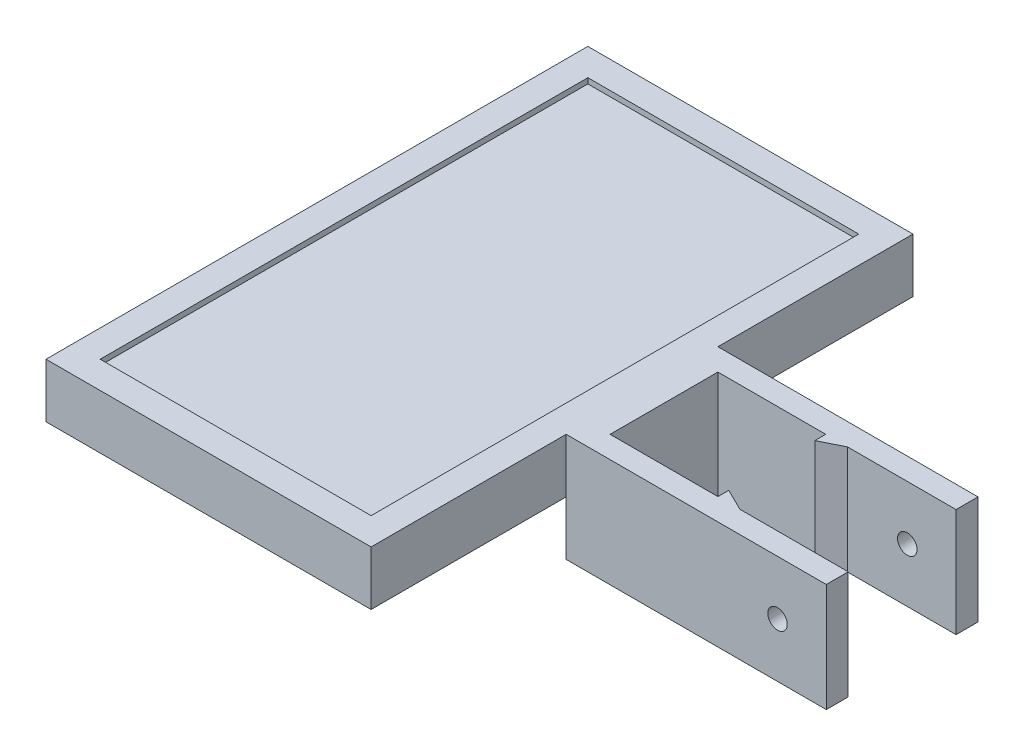
ISO-10303-21;
HEADER;
FILE_DESCRIPTION(('STEP AP214'),'2;1');
FILE_NAME('part.step','',(''),(''),'','','');
FILE_SCHEMA(('AUTOMOTIVE_DESIGN { 1 0 10303 214 1 1 1 1 }'));
ENDSEC;
DATA;
#1=APPLICATION_CONTEXT('core data for automotive mechanical design processes');
#2=APPLICATION_PROTOCOL_DEFINITION('international standard','automotive_design',2000,#1);
#3=PRODUCT_CONTEXT('',#1,'mechanical');
#4=PRODUCT('Part','Part','',(#3));
#5=PRODUCT_RELATED_PRODUCT_CATEGORY('part','',(#4));
#6=PRODUCT_DEFINITION_FORMATION('','',#4);
#7=PRODUCT_DEFINITION_CONTEXT('part definition',#1,'design');
#8=PRODUCT_DEFINITION('design','',#6,#7);
#9=PRODUCT_DEFINITION_SHAPE('','',#8);
#10=(LENGTH_UNIT() NAMED_UNIT(*) SI_UNIT(.MILLI.,.METRE.));
#11=(NAMED_UNIT(*) PLANE_ANGLE_UNIT() SI_UNIT($,.RADIAN.));
#12=(NAMED_UNIT(*) SI_UNIT($,.STERADIAN.) SOLID_ANGLE_UNIT());
#13=UNCERTAINTY_MEASURE_WITH_UNIT(LENGTH_MEASURE(1.E-05),#10,'distance_accuracy_value','');
#14=(GEOMETRIC_REPRESENTATION_CONTEXT(3) GLOBAL_UNCERTAINTY_ASSIGNED_CONTEXT((#13)) GLOBAL_UNIT_ASSIGNED_CONTEXT((#10,
#11,#12)) REPRESENTATION_CONTEXT('',''));
#15=CARTESIAN_POINT('',(0.,0.,0.));
#16=DIRECTION('',(0.,0.,1.));
#17=DIRECTION('',(1.,0.,0.));
#18=AXIS2_PLACEMENT_3D('',#15,#16,#17);
#19=CARTESIAN_POINT('',(-74.,10.,-50.));
#20=DIRECTION('',(-1.,0.,0.));
#21=DIRECTION('',(0.,0.,1.));
#22=AXIS2_PLACEMENT_3D('',#19,#20,#21);
#23=PLANE('',#22);
#24=DIRECTION('',(0.,0.,1.));
#25=VECTOR('',#24,1.);
#26=CARTESIAN_POINT('',(-74.,10.,-50.));
#27=LINE('',#26,#25);
#28=CARTESIAN_POINT('',(-74.,10.,-50.));
#29=VERTEX_POINT('',#28);
#30=CARTESIAN_POINT('',(-74.,10.,-5.));
#31=VERTEX_POINT('',#30);
#32=EDGE_CURVE('E314',#29,#31,#27,.T.);
#33=ORIENTED_EDGE('',*,*,#32,.T.);
#34=DIRECTION('',(0.,0.,1.));
#35=VECTOR('',#34,1.);
#36=CARTESIAN_POINT('',(-74.,10.,-50.001));
#37=LINE('',#36,#35);
#38=CARTESIAN_POINT('',(-74.,10.,5.));
#39=VERTEX_POINT('',#38);
#40=EDGE_CURVE('E282',#31,#39,#37,.T.);
#41=ORIENTED_EDGE('',*,*,#40,.T.);
#42=CARTESIAN_POINT('',(-74.,10.,50.));
#43=VERTEX_POINT('',#42);
#44=EDGE_CURVE('E311',#39,#43,#27,.T.);
#45=ORIENTED_EDGE('',*,*,#44,.T.);
#46=DIRECTION('',(0.,1.,0.));
#47=VECTOR('',#46,1.);
#48=CARTESIAN_POINT('',(-74.,10.,50.));
#49=LINE('',#48,#47);
#50=CARTESIAN_POINT('',(-74.,20.,50.));
#51=VERTEX_POINT('',#50);
#52=EDGE_CURVE('E341',#43,#51,#49,.T.);
#53=ORIENTED_EDGE('',*,*,#52,.T.);
#54=DIRECTION('',(0.,0.,1.));
#55=VECTOR('',#54,1.);
#56=CARTESIAN_POINT('',(-74.,20.,-50.));
#57=LINE('',#56,#55);
#58=CARTESIAN_POINT('',(-74.,20.,-50.));
#59=VERTEX_POINT('',#58);
#60=EDGE_CURVE('E332',#59,#51,#57,.T.);
#61=ORIENTED_EDGE('',*,*,#60,.F.);
#62=DIRECTION('',(0.,1.,0.));
#63=VECTOR('',#62,1.);
#64=CARTESIAN_POINT('',(-74.,10.,-50.));
#65=LINE('',#64,#63);
#66=EDGE_CURVE('E347',#29,#59,#65,.T.);
#67=ORIENTED_EDGE('',*,*,#66,.F.);
#68=EDGE_LOOP('',(#33,#41,#45,#53,#61,#67));
#69=FACE_BOUND('',#68,.T.);
#70=ADVANCED_FACE('F47',(#69),#23,.T.);
#71=CARTESIAN_POINT('',(-88.142135623731,10.,-5.));
#72=DIRECTION('',(0.,0.,1.));
#73=DIRECTION('',(0.,-1.,0.));
#74=AXIS2_PLACEMENT_3D('',#71,#72,#73);
#75=PLANE('',#74);
#76=DIRECTION('',(0.986393923832144,-0.164398987305357,0.));
#77=VECTOR('',#76,1.);
#78=CARTESIAN_POINT('',(-14.,0.,-5.));
#79=LINE('',#78,#77);
#80=CARTESIAN_POINT('',(-14.,0.,-5.));
#81=VERTEX_POINT('',#80);
#82=EDGE_CURVE('E274',#31,#81,#79,.T.);
#83=ORIENTED_EDGE('',*,*,#82,.F.);
#84=DIRECTION('',(1.,0.,0.));
#85=VECTOR('',#84,1.);
#86=CARTESIAN_POINT('',(-88.142135623731,10.,-5.));
#87=LINE('',#86,#85);
#88=CARTESIAN_POINT('',(-14.,10.,-5.));
#89=VERTEX_POINT('',#88);
#90=EDGE_CURVE('E289',#31,#89,#87,.T.);
#91=ORIENTED_EDGE('',*,*,#90,.T.);
#92=DIRECTION('',(0.,-1.,0.));
#93=VECTOR('',#92,1.);
#94=CARTESIAN_POINT('',(-14.,10.,-5.));
#95=LINE('',#94,#93);
#96=EDGE_CURVE('E296',#89,#81,#95,.T.);
#97=ORIENTED_EDGE('',*,*,#96,.T.);
#98=EDGE_LOOP('',(#83,#91,#97));
#99=FACE_BOUND('',#98,.T.);
#100=ADVANCED_FACE('F661',(#99),#75,.F.);
#101=CARTESIAN_POINT('',(-88.142135623731,10.,5.));
#102=DIRECTION('',(0.,0.,-1.));
#103=DIRECTION('',(0.,1.,0.));
#104=AXIS2_PLACEMENT_3D('',#101,#102,#103);
#105=PLANE('',#104);
#106=DIRECTION('',(-0.986393923832144,0.164398987305357,0.));
#107=VECTOR('',#106,1.);
#108=CARTESIAN_POINT('',(-14.,0.,5.));
#109=LINE('',#108,#107);
#110=CARTESIAN_POINT('',(-14.,0.,5.));
#111=VERTEX_POINT('',#110);
#112=EDGE_CURVE('E281',#111,#39,#109,.T.);
#113=ORIENTED_EDGE('',*,*,#112,.F.);
#114=DIRECTION('',(0.,1.,0.));
#115=VECTOR('',#114,1.);
#116=CARTESIAN_POINT('',(-14.,10.,5.));
#117=LINE('',#116,#115);
#118=CARTESIAN_POINT('',(-14.,10.,5.));
#119=VERTEX_POINT('',#118);
#120=EDGE_CURVE('E291',#111,#119,#117,.T.);
#121=ORIENTED_EDGE('',*,*,#120,.T.);
#122=DIRECTION('',(1.,0.,0.));
#123=VECTOR('',#122,1.);
#124=CARTESIAN_POINT('',(-88.142135623731,10.,5.));
#125=LINE('',#124,#123);
#126=EDGE_CURVE('E76',#39,#119,#125,.T.);
#127=ORIENTED_EDGE('',*,*,#126,.F.);
#128=EDGE_LOOP('',(#113,#121,#127));
#129=FACE_BOUND('',#128,.T.);
#130=ADVANCED_FACE('F536',(#129),#105,.F.);
#131=CARTESIAN_POINT('',(-14.,20.,14.));
#132=DIRECTION('',(1.,0.,0.));
#133=DIRECTION('',(0.,0.,-1.));
#134=AXIS2_PLACEMENT_3D('',#131,#132,#133);
#135=PLANE('',#134);
#136=ORIENTED_EDGE('',*,*,#96,.F.);
#137=DIRECTION('',(0.,0.,-1.));
#138=VECTOR('',#137,1.);
#139=CARTESIAN_POINT('',(-14.,10.,-50.));
#140=LINE('',#139,#138);
#141=CARTESIAN_POINT('',(-14.,10.,-14.));
#142=VERTEX_POINT('',#141);
#143=EDGE_CURVE('E56',#89,#142,#140,.T.);
#144=ORIENTED_EDGE('',*,*,#143,.T.);
#145=DIRECTION('',(0.,-1.,0.));
#146=VECTOR('',#145,1.);
#147=CARTESIAN_POINT('',(-14.,20.,-14.));
#148=LINE('',#147,#146);
#149=CARTESIAN_POINT('',(-14.,0.,-14.));
#150=VERTEX_POINT('',#149);
#151=EDGE_CURVE('E508',#142,#150,#148,.T.);
#152=ORIENTED_EDGE('',*,*,#151,.T.);
#153=DIRECTION('',(0.,0.,1.));
#154=VECTOR('',#153,1.);
#155=CARTESIAN_POINT('',(-14.,0.,14.));
#156=LINE('',#155,#154);
#157=EDGE_CURVE('E500',#150,#81,#156,.T.);
#158=ORIENTED_EDGE('',*,*,#157,.T.);
#159=EDGE_LOOP('',(#136,#144,#152,#158));
#160=FACE_BOUND('',#159,.T.);
#161=ADVANCED_FACE('F518',(#160),#135,.F.);
#162=ORIENTED_EDGE('',*,*,#120,.F.);
#163=CARTESIAN_POINT('',(-14.,0.,14.));
#164=VERTEX_POINT('',#163);
#165=EDGE_CURVE('E497',#111,#164,#156,.T.);
#166=ORIENTED_EDGE('',*,*,#165,.T.);
#167=DIRECTION('',(0.,-1.,0.));
#168=VECTOR('',#167,1.);
#169=CARTESIAN_POINT('',(-14.,20.,14.));
#170=LINE('',#169,#168);
#171=CARTESIAN_POINT('',(-14.,10.,14.));
#172=VERTEX_POINT('',#171);
#173=EDGE_CURVE('E495',#172,#164,#170,.T.);
#174=ORIENTED_EDGE('',*,*,#173,.F.);
#175=EDGE_CURVE('E11',#172,#119,#140,.T.);
#176=ORIENTED_EDGE('',*,*,#175,.T.);
#177=EDGE_LOOP('',(#162,#166,#174,#176));
#178=FACE_BOUND('',#177,.T.);
#179=ADVANCED_FACE('F538',(#178),#135,.F.);
#180=CARTESIAN_POINT('',(0.,10.,0.));
#181=DIRECTION('',(0.,-1.,0.));
#182=DIRECTION('',(0.,0.,-1.));
#183=AXIS2_PLACEMENT_3D('',#180,#181,#182);
#184=PLANE('',#183);
#185=ORIENTED_EDGE('',*,*,#44,.F.);
#186=ORIENTED_EDGE('',*,*,#126,.T.);
#187=ORIENTED_EDGE('',*,*,#175,.F.);
#188=CARTESIAN_POINT('',(-14.,10.,50.));
#189=VERTEX_POINT('',#188);
#190=EDGE_CURVE('E64',#189,#172,#140,.T.);
#191=ORIENTED_EDGE('',*,*,#190,.F.);
#192=DIRECTION('',(1.,0.,0.));
#193=VECTOR('',#192,1.);
#194=CARTESIAN_POINT('',(-14.,10.,50.));
#195=LINE('',#194,#193);
#196=EDGE_CURVE('E318',#43,#189,#195,.T.);
#197=ORIENTED_EDGE('',*,*,#196,.F.);
#198=EDGE_LOOP('',(#185,#186,#187,#191,#197));
#199=FACE_BOUND('',#198,.T.);
#200=ADVANCED_FACE('F545',(#199),#184,.T.);
#201=CARTESIAN_POINT('',(0.,20.,0.));
#202=DIRECTION('',(0.,-1.,0.));
#203=DIRECTION('',(0.,0.,-1.));
#204=AXIS2_PLACEMENT_3D('',#201,#202,#203);
#205=PLANE('',#204);
#206=DIRECTION('',(1.,0.,0.));
#207=VECTOR('',#206,1.);
#208=CARTESIAN_POINT('',(-69.,20.,45.));
#209=LINE('',#208,#207);
#210=CARTESIAN_POINT('',(-69.,20.,45.));
#211=VERTEX_POINT('',#210);
#212=CARTESIAN_POINT('',(-19.,20.,45.));
#213=VERTEX_POINT('',#212);
#214=EDGE_CURVE('E266',#211,#213,#209,.T.);
#215=ORIENTED_EDGE('',*,*,#214,.F.);
#216=DIRECTION('',(0.,0.,1.));
#217=VECTOR('',#216,1.);
#218=CARTESIAN_POINT('',(-69.,20.,-45.));
#219=LINE('',#218,#217);
#220=CARTESIAN_POINT('',(-69.,20.,-45.));
#221=VERTEX_POINT('',#220);
#222=EDGE_CURVE('E69',#221,#211,#219,.T.);
#223=ORIENTED_EDGE('',*,*,#222,.F.);
#224=DIRECTION('',(-1.,0.,0.));
#225=VECTOR('',#224,1.);
#226=CARTESIAN_POINT('',(-69.,20.,-45.));
#227=LINE('',#226,#225);
#228=CARTESIAN_POINT('',(-19.,20.,-45.));
#229=VERTEX_POINT('',#228);
#230=EDGE_CURVE('E247',#229,#221,#227,.T.);
#231=ORIENTED_EDGE('',*,*,#230,.F.);
#232=DIRECTION('',(0.,0.,-1.));
#233=VECTOR('',#232,1.);
#234=CARTESIAN_POINT('',(-19.,20.,-45.));
#235=LINE('',#234,#233);
#236=EDGE_CURVE('E260',#213,#229,#235,.T.);
#237=ORIENTED_EDGE('',*,*,#236,.F.);
#238=EDGE_LOOP('',(#215,#223,#231,#237));
#239=FACE_BOUND('',#238,.T.);
#240=DIRECTION('',(-0.896630132720614,0.,0.442780312454624));
#241=VECTOR('',#240,1.);
#242=CARTESIAN_POINT('',(14.,20.,-9.95));
#243=LINE('',#242,#241);
#244=CARTESIAN_POINT('',(14.,20.,-9.95));
#245=VERTEX_POINT('',#244);
#246=CARTESIAN_POINT('',(9.95,20.,-7.94999999999999));
#247=VERTEX_POINT('',#246);
#248=EDGE_CURVE('E384',#245,#247,#243,.T.);
#249=ORIENTED_EDGE('',*,*,#248,.F.);
#250=DIRECTION('',(1.,0.,0.));
#251=VECTOR('',#250,1.);
#252=CARTESIAN_POINT('',(14.,20.,-9.95));
#253=LINE('',#252,#251);
#254=CARTESIAN_POINT('',(34.,20.,-9.95));
#255=VERTEX_POINT('',#254);
#256=EDGE_CURVE('E373',#245,#255,#253,.T.);
#257=ORIENTED_EDGE('',*,*,#256,.T.);
#258=DIRECTION('',(0.,0.,-1.));
#259=VECTOR('',#258,1.);
#260=CARTESIAN_POINT('',(34.,20.,-9.95));
#261=LINE('',#260,#259);
#262=CARTESIAN_POINT('',(34.,20.,-14.));
#263=VERTEX_POINT('',#262);
#264=EDGE_CURVE('E366',#255,#263,#261,.T.);
#265=ORIENTED_EDGE('',*,*,#264,.T.);
#266=DIRECTION('',(-1.,0.,0.));
#267=VECTOR('',#266,1.);
#268=CARTESIAN_POINT('',(-14.,20.,-14.));
#269=LINE('',#268,#267);
#270=CARTESIAN_POINT('',(-14.,20.,-14.));
#271=VERTEX_POINT('',#270);
#272=EDGE_CURVE('E482',#263,#271,#269,.T.);
#273=ORIENTED_EDGE('',*,*,#272,.T.);
#274=DIRECTION('',(0.,0.,-1.));
#275=VECTOR('',#274,1.);
#276=CARTESIAN_POINT('',(-14.,20.,-50.));
#277=LINE('',#276,#275);
#278=CARTESIAN_POINT('',(-14.,20.,-50.));
#279=VERTEX_POINT('',#278);
#280=EDGE_CURVE('E301',#271,#279,#277,.T.);
#281=ORIENTED_EDGE('',*,*,#280,.T.);
#282=DIRECTION('',(-1.,0.,0.));
#283=VECTOR('',#282,1.);
#284=CARTESIAN_POINT('',(-14.,20.,-50.));
#285=LINE('',#284,#283);
#286=EDGE_CURVE('E330',#279,#59,#285,.T.);
#287=ORIENTED_EDGE('',*,*,#286,.T.);
#288=ORIENTED_EDGE('',*,*,#60,.T.);
#289=DIRECTION('',(1.,0.,0.));
#290=VECTOR('',#289,1.);
#291=CARTESIAN_POINT('',(-14.,20.,50.));
#292=LINE('',#291,#290);
#293=CARTESIAN_POINT('',(-14.,20.,50.));
#294=VERTEX_POINT('',#293);
#295=EDGE_CURVE('E333',#51,#294,#292,.T.);
#296=ORIENTED_EDGE('',*,*,#295,.T.);
#297=CARTESIAN_POINT('',(-14.,20.,14.));
#298=VERTEX_POINT('',#297);
#299=EDGE_CURVE('E323',#294,#298,#277,.T.);
#300=ORIENTED_EDGE('',*,*,#299,.T.);
#301=DIRECTION('',(1.,0.,0.));
#302=VECTOR('',#301,1.);
#303=CARTESIAN_POINT('',(-14.,20.,14.));
#304=LINE('',#303,#302);
#305=CARTESIAN_POINT('',(34.,20.,14.));
#306=VERTEX_POINT('',#305);
#307=EDGE_CURVE('E488',#298,#306,#304,.T.);
#308=ORIENTED_EDGE('',*,*,#307,.T.);
#309=DIRECTION('',(0.,0.,-1.));
#310=VECTOR('',#309,1.);
#311=CARTESIAN_POINT('',(34.,20.,9.95));
#312=LINE('',#311,#310);
#313=CARTESIAN_POINT('',(34.,20.,9.95));
#314=VERTEX_POINT('',#313);
#315=EDGE_CURVE('E380',#306,#314,#312,.T.);
#316=ORIENTED_EDGE('',*,*,#315,.T.);
#317=DIRECTION('',(-1.,0.,0.));
#318=VECTOR('',#317,1.);
#319=CARTESIAN_POINT('',(14.,20.,9.95));
#320=LINE('',#319,#318);
#321=CARTESIAN_POINT('',(14.,20.,9.95));
#322=VERTEX_POINT('',#321);
#323=EDGE_CURVE('E392',#314,#322,#320,.T.);
#324=ORIENTED_EDGE('',*,*,#323,.T.);
#325=DIRECTION('',(0.896630132720614,0.,0.442780312454624));
#326=VECTOR('',#325,1.);
#327=CARTESIAN_POINT('',(9.95,20.,7.95));
#328=LINE('',#327,#326);
#329=CARTESIAN_POINT('',(9.95,20.,7.95));
#330=VERTEX_POINT('',#329);
#331=EDGE_CURVE('E414',#330,#322,#328,.T.);
#332=ORIENTED_EDGE('',*,*,#331,.F.);
#333=DIRECTION('',(0.,0.,-1.));
#334=VECTOR('',#333,1.);
#335=CARTESIAN_POINT('',(9.95,20.,9.95));
#336=LINE('',#335,#334);
#337=CARTESIAN_POINT('',(9.95,20.,9.95));
#338=VERTEX_POINT('',#337);
#339=EDGE_CURVE('E437',#338,#330,#336,.T.);
#340=ORIENTED_EDGE('',*,*,#339,.F.);
#341=DIRECTION('',(1.,0.,0.));
#342=VECTOR('',#341,1.);
#343=CARTESIAN_POINT('',(-9.95,20.,9.95));
#344=LINE('',#343,#342);
#345=CARTESIAN_POINT('',(-9.95,20.,9.95));
#346=VERTEX_POINT('',#345);
#347=EDGE_CURVE('E447',#346,#338,#344,.T.);
#348=ORIENTED_EDGE('',*,*,#347,.F.);
#349=DIRECTION('',(0.,0.,1.));
#350=VECTOR('',#349,1.);
#351=CARTESIAN_POINT('',(-9.95,20.,9.95));
#352=LINE('',#351,#350);
#353=CARTESIAN_POINT('',(-9.95,20.,-9.95));
#354=VERTEX_POINT('',#353);
#355=EDGE_CURVE('E449',#354,#346,#352,.T.);
#356=ORIENTED_EDGE('',*,*,#355,.F.);
#357=DIRECTION('',(-1.,0.,0.));
#358=VECTOR('',#357,1.);
#359=CARTESIAN_POINT('',(-9.95,20.,-9.95));
#360=LINE('',#359,#358);
#361=CARTESIAN_POINT('',(9.95,20.,-9.95));
#362=VERTEX_POINT('',#361);
#363=EDGE_CURVE('E445',#362,#354,#360,.T.);
#364=ORIENTED_EDGE('',*,*,#363,.F.);
#365=EDGE_CURVE('E444',#247,#362,#336,.T.);
#366=ORIENTED_EDGE('',*,*,#365,.F.);
#367=EDGE_LOOP('',(#249,#257,#265,#273,#281,#287,#288,#296,#300,#308,#316,#324,#332,#340,#348,
#356,#364,#366));
#368=FACE_BOUND('',#367,.T.);
#369=ADVANCED_FACE('F720',(#239,#368),#205,.F.);
#370=CARTESIAN_POINT('',(0.,0.,0.));
#371=DIRECTION('',(0.,-1.,0.));
#372=DIRECTION('',(0.,0.,-1.));
#373=AXIS2_PLACEMENT_3D('',#370,#371,#372);
#374=PLANE('',#373);
#375=DIRECTION('',(0.,0.,1.));
#376=VECTOR('',#375,1.);
#377=CARTESIAN_POINT('',(-14.,0.,-50.001));
#378=LINE('',#377,#376);
#379=EDGE_CURVE('E288',#81,#111,#378,.T.);
#380=ORIENTED_EDGE('',*,*,#379,.F.);
#381=ORIENTED_EDGE('',*,*,#157,.F.);
#382=DIRECTION('',(-1.,0.,0.));
#383=VECTOR('',#382,1.);
#384=CARTESIAN_POINT('',(-14.,0.,-14.));
#385=LINE('',#384,#383);
#386=CARTESIAN_POINT('',(34.,0.,-14.));
#387=VERTEX_POINT('',#386);
#388=EDGE_CURVE('E483',#387,#150,#385,.T.);
#389=ORIENTED_EDGE('',*,*,#388,.F.);
#390=DIRECTION('',(0.,0.,-1.));
#391=VECTOR('',#390,1.);
#392=CARTESIAN_POINT('',(34.,0.,-9.95));
#393=LINE('',#392,#391);
#394=CARTESIAN_POINT('',(34.,0.,-9.95));
#395=VERTEX_POINT('',#394);
#396=EDGE_CURVE('E370',#395,#387,#393,.T.);
#397=ORIENTED_EDGE('',*,*,#396,.F.);
#398=DIRECTION('',(1.,0.,0.));
#399=VECTOR('',#398,1.);
#400=CARTESIAN_POINT('',(14.,0.,-9.95));
#401=LINE('',#400,#399);
#402=CARTESIAN_POINT('',(14.,0.,-9.95));
#403=VERTEX_POINT('',#402);
#404=EDGE_CURVE('E361',#403,#395,#401,.T.);
#405=ORIENTED_EDGE('',*,*,#404,.F.);
#406=DIRECTION('',(-0.896630132720614,0.,0.442780312454624));
#407=VECTOR('',#406,1.);
#408=CARTESIAN_POINT('',(14.,0.,-9.95));
#409=LINE('',#408,#407);
#410=CARTESIAN_POINT('',(9.95,0.,-7.95));
#411=VERTEX_POINT('',#410);
#412=EDGE_CURVE('E408',#403,#411,#409,.T.);
#413=ORIENTED_EDGE('',*,*,#412,.T.);
#414=DIRECTION('',(0.,0.,-1.));
#415=VECTOR('',#414,1.);
#416=CARTESIAN_POINT('',(9.95,0.,9.95));
#417=LINE('',#416,#415);
#418=CARTESIAN_POINT('',(9.95,0.,-9.95));
#419=VERTEX_POINT('',#418);
#420=EDGE_CURVE('E430',#411,#419,#417,.T.);
#421=ORIENTED_EDGE('',*,*,#420,.T.);
#422=DIRECTION('',(-1.,0.,0.));
#423=VECTOR('',#422,1.);
#424=CARTESIAN_POINT('',(-9.95,0.,-9.95));
#425=LINE('',#424,#423);
#426=CARTESIAN_POINT('',(-9.95,0.,-9.95));
#427=VERTEX_POINT('',#426);
#428=EDGE_CURVE('E456',#419,#427,#425,.T.);
#429=ORIENTED_EDGE('',*,*,#428,.T.);
#430=DIRECTION('',(0.,0.,1.));
#431=VECTOR('',#430,1.);
#432=CARTESIAN_POINT('',(-9.95,0.,9.95));
#433=LINE('',#432,#431);
#434=CARTESIAN_POINT('',(-9.95,0.,9.95));
#435=VERTEX_POINT('',#434);
#436=EDGE_CURVE('E461',#427,#435,#433,.T.);
#437=ORIENTED_EDGE('',*,*,#436,.T.);
#438=DIRECTION('',(1.,0.,0.));
#439=VECTOR('',#438,1.);
#440=CARTESIAN_POINT('',(-9.95,0.,9.95));
#441=LINE('',#440,#439);
#442=CARTESIAN_POINT('',(9.95,0.,9.95));
#443=VERTEX_POINT('',#442);
#444=EDGE_CURVE('E468',#435,#443,#441,.T.);
#445=ORIENTED_EDGE('',*,*,#444,.T.);
#446=CARTESIAN_POINT('',(9.95,0.,7.95));
#447=VERTEX_POINT('',#446);
#448=EDGE_CURVE('E454',#443,#447,#417,.T.);
#449=ORIENTED_EDGE('',*,*,#448,.T.);
#450=DIRECTION('',(0.896630132720614,0.,0.442780312454624));
#451=VECTOR('',#450,1.);
#452=CARTESIAN_POINT('',(9.95,0.,7.95));
#453=LINE('',#452,#451);
#454=CARTESIAN_POINT('',(14.,0.,9.95));
#455=VERTEX_POINT('',#454);
#456=EDGE_CURVE('E411',#447,#455,#453,.T.);
#457=ORIENTED_EDGE('',*,*,#456,.T.);
#458=DIRECTION('',(-1.,0.,0.));
#459=VECTOR('',#458,1.);
#460=CARTESIAN_POINT('',(14.,0.,9.95));
#461=LINE('',#460,#459);
#462=CARTESIAN_POINT('',(34.,0.,9.95));
#463=VERTEX_POINT('',#462);
#464=EDGE_CURVE('E391',#463,#455,#461,.T.);
#465=ORIENTED_EDGE('',*,*,#464,.F.);
#466=DIRECTION('',(0.,0.,-1.));
#467=VECTOR('',#466,1.);
#468=CARTESIAN_POINT('',(34.,0.,9.95));
#469=LINE('',#468,#467);
#470=CARTESIAN_POINT('',(34.,0.,14.));
#471=VERTEX_POINT('',#470);
#472=EDGE_CURVE('E399',#471,#463,#469,.T.);
#473=ORIENTED_EDGE('',*,*,#472,.F.);
#474=DIRECTION('',(1.,0.,0.));
#475=VECTOR('',#474,1.);
#476=CARTESIAN_POINT('',(-14.,0.,14.));
#477=LINE('',#476,#475);
#478=EDGE_CURVE('E487',#164,#471,#477,.T.);
#479=ORIENTED_EDGE('',*,*,#478,.F.);
#480=ORIENTED_EDGE('',*,*,#165,.F.);
#481=EDGE_LOOP('',(#380,#381,#389,#397,#405,#413,#421,#429,#437,#445,#449,#457,#465,#473,#479,#480));
#482=FACE_BOUND('',#481,.T.);
#483=ADVANCED_FACE('F527',(#482),#374,.T.);
#484=CARTESIAN_POINT('',(9.95,20.,9.95));
#485=DIRECTION('',(-1.,0.,0.));
#486=DIRECTION('',(0.,0.,1.));
#487=AXIS2_PLACEMENT_3D('',#484,#485,#486);
#488=PLANE('',#487);
#489=ORIENTED_EDGE('',*,*,#420,.F.);
#490=DIRECTION('',(0.,1.,0.));
#491=VECTOR('',#490,1.);
#492=CARTESIAN_POINT('',(9.95,0.,-7.95));
#493=LINE('',#492,#491);
#494=EDGE_CURVE('E431',#411,#247,#493,.T.);
#495=ORIENTED_EDGE('',*,*,#494,.T.);
#496=ORIENTED_EDGE('',*,*,#365,.T.);
#497=DIRECTION('',(0.,-1.,0.));
#498=VECTOR('',#497,1.);
#499=CARTESIAN_POINT('',(9.95,20.,-9.95));
#500=LINE('',#499,#498);
#501=EDGE_CURVE('E479',#362,#419,#500,.T.);
#502=ORIENTED_EDGE('',*,*,#501,.T.);
#503=EDGE_LOOP('',(#489,#495,#496,#502));
#504=FACE_BOUND('',#503,.T.);
#505=ADVANCED_FACE('F652',(#504),#488,.T.);
#506=CARTESIAN_POINT('',(-14.,20.,-14.));
#507=DIRECTION('',(0.,0.,1.));
#508=DIRECTION('',(1.,0.,0.));
#509=AXIS2_PLACEMENT_3D('',#506,#507,#508);
#510=PLANE('',#509);
#511=CARTESIAN_POINT('',(25.,10.,-14.));
#512=DIRECTION('',(0.,0.,1.));
#513=DIRECTION('',(1.,0.,0.));
#514=AXIS2_PLACEMENT_3D('',#511,#512,#513);
#515=CIRCLE('',#514,1.8);
#516=CARTESIAN_POINT('',(26.8,10.,-14.));
#517=VERTEX_POINT('',#516);
#518=EDGE_CURVE('E345',#517,#517,#515,.F.);
#519=ORIENTED_EDGE('',*,*,#518,.F.);
#520=EDGE_LOOP('',(#519));
#521=FACE_BOUND('',#520,.T.);
#522=ORIENTED_EDGE('',*,*,#388,.T.);
#523=ORIENTED_EDGE('',*,*,#151,.F.);
#524=EDGE_CURVE('E510',#271,#142,#148,.T.);
#525=ORIENTED_EDGE('',*,*,#524,.F.);
#526=ORIENTED_EDGE('',*,*,#272,.F.);
#527=DIRECTION('',(0.,1.,0.));
#528=VECTOR('',#527,1.);
#529=CARTESIAN_POINT('',(34.,0.,-14.));
#530=LINE('',#529,#528);
#531=EDGE_CURVE('E381',#387,#263,#530,.T.);
#532=ORIENTED_EDGE('',*,*,#531,.F.);
#533=EDGE_LOOP('',(#522,#523,#525,#526,#532));
#534=FACE_BOUND('',#533,.T.);
#535=ADVANCED_FACE('F51',(#521,#534),#510,.F.);
#536=CARTESIAN_POINT('',(-14.,20.,14.));
#537=DIRECTION('',(0.,0.,-1.));
#538=DIRECTION('',(-1.,0.,0.));
#539=AXIS2_PLACEMENT_3D('',#536,#537,#538);
#540=PLANE('',#539);
#541=CARTESIAN_POINT('',(25.,10.,14.));
#542=DIRECTION('',(0.,0.,-1.));
#543=DIRECTION('',(-1.,0.,0.));
#544=AXIS2_PLACEMENT_3D('',#541,#542,#543);
#545=CIRCLE('',#544,1.8);
#546=CARTESIAN_POINT('',(23.2,10.,14.));
#547=VERTEX_POINT('',#546);
#548=EDGE_CURVE('E353',#547,#547,#545,.T.);
#549=ORIENTED_EDGE('',*,*,#548,.T.);
#550=EDGE_LOOP('',(#549));
#551=FACE_BOUND('',#550,.T.);
#552=ORIENTED_EDGE('',*,*,#478,.T.);
#553=DIRECTION('',(0.,1.,0.));
#554=VECTOR('',#553,1.);
#555=CARTESIAN_POINT('',(34.,0.,14.));
#556=LINE('',#555,#554);
#557=EDGE_CURVE('E389',#471,#306,#556,.T.);
#558=ORIENTED_EDGE('',*,*,#557,.T.);
#559=ORIENTED_EDGE('',*,*,#307,.F.);
#560=EDGE_CURVE('E505',#298,#172,#170,.T.);
#561=ORIENTED_EDGE('',*,*,#560,.T.);
#562=ORIENTED_EDGE('',*,*,#173,.T.);
#563=EDGE_LOOP('',(#552,#558,#559,#561,#562));
#564=FACE_BOUND('',#563,.T.);
#565=ADVANCED_FACE('F653',(#551,#564),#540,.F.);
#566=DIRECTION('',(0.,1.,0.));
#567=VECTOR('',#566,1.);
#568=CARTESIAN_POINT('',(9.95,0.,7.95));
#569=LINE('',#568,#567);
#570=EDGE_CURVE('E428',#447,#330,#569,.T.);
#571=ORIENTED_EDGE('',*,*,#570,.F.);
#572=ORIENTED_EDGE('',*,*,#448,.F.);
#573=DIRECTION('',(0.,-1.,0.));
#574=VECTOR('',#573,1.);
#575=CARTESIAN_POINT('',(9.95,20.,9.95));
#576=LINE('',#575,#574);
#577=EDGE_CURVE('E451',#338,#443,#576,.T.);
#578=ORIENTED_EDGE('',*,*,#577,.F.);
#579=ORIENTED_EDGE('',*,*,#339,.T.);
#580=EDGE_LOOP('',(#571,#572,#578,#579));
#581=FACE_BOUND('',#580,.T.);
#582=ADVANCED_FACE('F657',(#581),#488,.T.);
#583=CARTESIAN_POINT('',(-9.95,20.,-9.95));
#584=DIRECTION('',(0.,0.,1.));
#585=DIRECTION('',(1.,0.,0.));
#586=AXIS2_PLACEMENT_3D('',#583,#584,#585);
#587=PLANE('',#586);
#588=ORIENTED_EDGE('',*,*,#428,.F.);
#589=ORIENTED_EDGE('',*,*,#501,.F.);
#590=ORIENTED_EDGE('',*,*,#363,.T.);
#591=DIRECTION('',(0.,-1.,0.));
#592=VECTOR('',#591,1.);
#593=CARTESIAN_POINT('',(-9.95,20.,-9.95));
#594=LINE('',#593,#592);
#595=EDGE_CURVE('E478',#354,#427,#594,.T.);
#596=ORIENTED_EDGE('',*,*,#595,.T.);
#597=EDGE_LOOP('',(#588,#589,#590,#596));
#598=FACE_BOUND('',#597,.T.);
#599=ADVANCED_FACE('F709',(#598),#587,.T.);
#600=CARTESIAN_POINT('',(-9.95,20.,9.95));
#601=DIRECTION('',(1.,0.,0.));
#602=DIRECTION('',(0.,0.,-1.));
#603=AXIS2_PLACEMENT_3D('',#600,#601,#602);
#604=PLANE('',#603);
#605=ORIENTED_EDGE('',*,*,#436,.F.);
#606=ORIENTED_EDGE('',*,*,#595,.F.);
#607=ORIENTED_EDGE('',*,*,#355,.T.);
#608=DIRECTION('',(0.,-1.,0.));
#609=VECTOR('',#608,1.);
#610=CARTESIAN_POINT('',(-9.95,20.,9.95));
#611=LINE('',#610,#609);
#612=EDGE_CURVE('E471',#346,#435,#611,.T.);
#613=ORIENTED_EDGE('',*,*,#612,.T.);
#614=EDGE_LOOP('',(#605,#606,#607,#613));
#615=FACE_BOUND('',#614,.T.);
#616=ADVANCED_FACE('F706',(#615),#604,.T.);
#617=CARTESIAN_POINT('',(-9.95,20.,9.95));
#618=DIRECTION('',(0.,0.,-1.));
#619=DIRECTION('',(-1.,0.,0.));
#620=AXIS2_PLACEMENT_3D('',#617,#618,#619);
#621=PLANE('',#620);
#622=ORIENTED_EDGE('',*,*,#444,.F.);
#623=ORIENTED_EDGE('',*,*,#612,.F.);
#624=ORIENTED_EDGE('',*,*,#347,.T.);
#625=ORIENTED_EDGE('',*,*,#577,.T.);
#626=EDGE_LOOP('',(#622,#623,#624,#625));
#627=FACE_BOUND('',#626,.T.);
#628=ADVANCED_FACE('F699',(#627),#621,.T.);
#629=CARTESIAN_POINT('',(9.95,0.,7.95));
#630=DIRECTION('',(-0.442780312454624,0.,0.896630132720614));
#631=DIRECTION('',(0.896630132720614,0.,0.442780312454624));
#632=AXIS2_PLACEMENT_3D('',#629,#630,#631);
#633=PLANE('',#632);
#634=ORIENTED_EDGE('',*,*,#331,.T.);
#635=DIRECTION('',(0.,1.,0.));
#636=VECTOR('',#635,1.);
#637=CARTESIAN_POINT('',(14.,0.,9.95));
#638=LINE('',#637,#636);
#639=EDGE_CURVE('E421',#455,#322,#638,.T.);
#640=ORIENTED_EDGE('',*,*,#639,.F.);
#641=ORIENTED_EDGE('',*,*,#456,.F.);
#642=ORIENTED_EDGE('',*,*,#570,.T.);
#643=EDGE_LOOP('',(#634,#640,#641,#642));
#644=FACE_BOUND('',#643,.T.);
#645=ADVANCED_FACE('F698',(#644),#633,.F.);
#646=CARTESIAN_POINT('',(14.,0.,-9.95));
#647=DIRECTION('',(-0.442780312454624,0.,-0.896630132720614));
#648=DIRECTION('',(-0.896630132720614,0.,0.442780312454624));
#649=AXIS2_PLACEMENT_3D('',#646,#647,#648);
#650=PLANE('',#649);
#651=ORIENTED_EDGE('',*,*,#248,.T.);
#652=ORIENTED_EDGE('',*,*,#494,.F.);
#653=ORIENTED_EDGE('',*,*,#412,.F.);
#654=DIRECTION('',(0.,1.,0.));
#655=VECTOR('',#654,1.);
#656=CARTESIAN_POINT('',(14.,0.,-9.95));
#657=LINE('',#656,#655);
#658=EDGE_CURVE('E416',#403,#245,#657,.T.);
#659=ORIENTED_EDGE('',*,*,#658,.T.);
#660=EDGE_LOOP('',(#651,#652,#653,#659));
#661=FACE_BOUND('',#660,.T.);
#662=ADVANCED_FACE('F695',(#661),#650,.F.);
#663=CARTESIAN_POINT('',(14.,0.,9.95));
#664=DIRECTION('',(0.,0.,-1.));
#665=DIRECTION('',(-1.,0.,0.));
#666=AXIS2_PLACEMENT_3D('',#663,#664,#665);
#667=PLANE('',#666);
#668=CARTESIAN_POINT('',(25.,10.,9.95));
#669=DIRECTION('',(0.,0.,-1.));
#670=DIRECTION('',(-1.,0.,0.));
#671=AXIS2_PLACEMENT_3D('',#668,#669,#670);
#672=CIRCLE('',#671,1.8);
#673=CARTESIAN_POINT('',(23.2,10.,9.95));
#674=VERTEX_POINT('',#673);
#675=EDGE_CURVE('E356',#674,#674,#672,.F.);
#676=ORIENTED_EDGE('',*,*,#675,.T.);
#677=EDGE_LOOP('',(#676));
#678=FACE_BOUND('',#677,.T.);
#679=ORIENTED_EDGE('',*,*,#323,.F.);
#680=DIRECTION('',(0.,1.,0.));
#681=VECTOR('',#680,1.);
#682=CARTESIAN_POINT('',(34.,0.,9.95));
#683=LINE('',#682,#681);
#684=EDGE_CURVE('E362',#463,#314,#683,.T.);
#685=ORIENTED_EDGE('',*,*,#684,.F.);
#686=ORIENTED_EDGE('',*,*,#464,.T.);
#687=ORIENTED_EDGE('',*,*,#639,.T.);
#688=EDGE_LOOP('',(#679,#685,#686,#687));
#689=FACE_BOUND('',#688,.T.);
#690=ADVANCED_FACE('F687',(#678,#689),#667,.T.);
#691=CARTESIAN_POINT('',(34.,0.,9.95));
#692=DIRECTION('',(1.,0.,0.));
#693=DIRECTION('',(0.,0.,-1.));
#694=AXIS2_PLACEMENT_3D('',#691,#692,#693);
#695=PLANE('',#694);
#696=ORIENTED_EDGE('',*,*,#315,.F.);
#697=ORIENTED_EDGE('',*,*,#557,.F.);
#698=ORIENTED_EDGE('',*,*,#472,.T.);
#699=ORIENTED_EDGE('',*,*,#684,.T.);
#700=EDGE_LOOP('',(#696,#697,#698,#699));
#701=FACE_BOUND('',#700,.T.);
#702=ADVANCED_FACE('F683',(#701),#695,.T.);
#703=CARTESIAN_POINT('',(34.,0.,-9.95));
#704=DIRECTION('',(1.,0.,0.));
#705=DIRECTION('',(0.,0.,-1.));
#706=AXIS2_PLACEMENT_3D('',#703,#704,#705);
#707=PLANE('',#706);
#708=ORIENTED_EDGE('',*,*,#264,.F.);
#709=DIRECTION('',(0.,1.,0.));
#710=VECTOR('',#709,1.);
#711=CARTESIAN_POINT('',(34.,0.,-9.95));
#712=LINE('',#711,#710);
#713=EDGE_CURVE('E375',#395,#255,#712,.T.);
#714=ORIENTED_EDGE('',*,*,#713,.F.);
#715=ORIENTED_EDGE('',*,*,#396,.T.);
#716=ORIENTED_EDGE('',*,*,#531,.T.);
#717=EDGE_LOOP('',(#708,#714,#715,#716));
#718=FACE_BOUND('',#717,.T.);
#719=ADVANCED_FACE('F684',(#718),#707,.T.);
#720=CARTESIAN_POINT('',(14.,0.,-9.95));
#721=DIRECTION('',(0.,0.,1.));
#722=DIRECTION('',(1.,0.,0.));
#723=AXIS2_PLACEMENT_3D('',#720,#721,#722);
#724=PLANE('',#723);
#725=CARTESIAN_POINT('',(25.,10.,-9.95));
#726=DIRECTION('',(0.,0.,1.));
#727=DIRECTION('',(1.,0.,0.));
#728=AXIS2_PLACEMENT_3D('',#725,#726,#727);
#729=CIRCLE('',#728,1.8);
#730=CARTESIAN_POINT('',(26.8,10.,-9.95));
#731=VERTEX_POINT('',#730);
#732=EDGE_CURVE('E52',#731,#731,#729,.F.);
#733=ORIENTED_EDGE('',*,*,#732,.T.);
#734=EDGE_LOOP('',(#733));
#735=FACE_BOUND('',#734,.T.);
#736=ORIENTED_EDGE('',*,*,#256,.F.);
#737=ORIENTED_EDGE('',*,*,#658,.F.);
#738=ORIENTED_EDGE('',*,*,#404,.T.);
#739=ORIENTED_EDGE('',*,*,#713,.T.);
#740=EDGE_LOOP('',(#736,#737,#738,#739));
#741=FACE_BOUND('',#740,.T.);
#742=ADVANCED_FACE('F645',(#735,#741),#724,.T.);
#743=CARTESIAN_POINT('',(25.,10.,19.0911688245431));
#744=DIRECTION('',(0.,0.,-1.));
#745=DIRECTION('',(-1.,0.,0.));
#746=AXIS2_PLACEMENT_3D('',#743,#744,#745);
#747=CYLINDRICAL_SURFACE('',#746,1.8);
#748=ORIENTED_EDGE('',*,*,#732,.F.);
#749=EDGE_LOOP('',(#748));
#750=FACE_BOUND('',#749,.T.);
#751=ORIENTED_EDGE('',*,*,#518,.T.);
#752=EDGE_LOOP('',(#751));
#753=FACE_BOUND('',#752,.T.);
#754=ADVANCED_FACE('F642',(#750,#753),#747,.F.);
#755=ORIENTED_EDGE('',*,*,#675,.F.);
#756=EDGE_LOOP('',(#755));
#757=FACE_BOUND('',#756,.T.);
#758=ORIENTED_EDGE('',*,*,#548,.F.);
#759=EDGE_LOOP('',(#758));
#760=FACE_BOUND('',#759,.T.);
#761=ADVANCED_FACE('F648',(#757,#760),#747,.F.);
#762=CARTESIAN_POINT('',(-14.,10.,-50.));
#763=DIRECTION('',(1.,0.,0.));
#764=DIRECTION('',(0.,0.,-1.));
#765=AXIS2_PLACEMENT_3D('',#762,#763,#764);
#766=PLANE('',#765);
#767=ORIENTED_EDGE('',*,*,#560,.F.);
#768=ORIENTED_EDGE('',*,*,#299,.F.);
#769=DIRECTION('',(0.,1.,0.));
#770=VECTOR('',#769,1.);
#771=CARTESIAN_POINT('',(-14.,10.,50.));
#772=LINE('',#771,#770);
#773=EDGE_CURVE('E338',#189,#294,#772,.T.);
#774=ORIENTED_EDGE('',*,*,#773,.F.);
#775=ORIENTED_EDGE('',*,*,#190,.T.);
#776=EDGE_LOOP('',(#767,#768,#774,#775));
#777=FACE_BOUND('',#776,.T.);
#778=ADVANCED_FACE('F544',(#777),#766,.T.);
#779=ORIENTED_EDGE('',*,*,#280,.F.);
#780=ORIENTED_EDGE('',*,*,#524,.T.);
#781=CARTESIAN_POINT('',(-14.,10.,-50.));
#782=VERTEX_POINT('',#781);
#783=EDGE_CURVE('E61',#142,#782,#140,.T.);
#784=ORIENTED_EDGE('',*,*,#783,.T.);
#785=DIRECTION('',(0.,1.,0.));
#786=VECTOR('',#785,1.);
#787=CARTESIAN_POINT('',(-14.,10.,-50.));
#788=LINE('',#787,#786);
#789=EDGE_CURVE('E325',#782,#279,#788,.T.);
#790=ORIENTED_EDGE('',*,*,#789,.T.);
#791=EDGE_LOOP('',(#779,#780,#784,#790));
#792=FACE_BOUND('',#791,.T.);
#793=ADVANCED_FACE('F676',(#792),#766,.T.);
#794=CARTESIAN_POINT('',(-14.,10.,50.));
#795=DIRECTION('',(0.,0.,1.));
#796=DIRECTION('',(1.,0.,0.));
#797=AXIS2_PLACEMENT_3D('',#794,#795,#796);
#798=PLANE('',#797);
#799=ORIENTED_EDGE('',*,*,#295,.F.);
#800=ORIENTED_EDGE('',*,*,#52,.F.);
#801=ORIENTED_EDGE('',*,*,#196,.T.);
#802=ORIENTED_EDGE('',*,*,#773,.T.);
#803=EDGE_LOOP('',(#799,#800,#801,#802));
#804=FACE_BOUND('',#803,.T.);
#805=ADVANCED_FACE('F548',(#804),#798,.T.);
#806=CARTESIAN_POINT('',(-14.,10.,-50.));
#807=DIRECTION('',(0.,0.,-1.));
#808=DIRECTION('',(-1.,0.,0.));
#809=AXIS2_PLACEMENT_3D('',#806,#807,#808);
#810=PLANE('',#809);
#811=ORIENTED_EDGE('',*,*,#286,.F.);
#812=ORIENTED_EDGE('',*,*,#789,.F.);
#813=DIRECTION('',(-1.,0.,0.));
#814=VECTOR('',#813,1.);
#815=CARTESIAN_POINT('',(-14.,10.,-50.));
#816=LINE('',#815,#814);
#817=EDGE_CURVE('E310',#782,#29,#816,.T.);
#818=ORIENTED_EDGE('',*,*,#817,.T.);
#819=ORIENTED_EDGE('',*,*,#66,.T.);
#820=EDGE_LOOP('',(#811,#812,#818,#819));
#821=FACE_BOUND('',#820,.T.);
#822=ADVANCED_FACE('F671',(#821),#810,.T.);
#823=ORIENTED_EDGE('',*,*,#90,.F.);
#824=ORIENTED_EDGE('',*,*,#32,.F.);
#825=ORIENTED_EDGE('',*,*,#817,.F.);
#826=ORIENTED_EDGE('',*,*,#783,.F.);
#827=ORIENTED_EDGE('',*,*,#143,.F.);
#828=EDGE_LOOP('',(#823,#824,#825,#826,#827));
#829=FACE_BOUND('',#828,.T.);
#830=ADVANCED_FACE('F677',(#829),#184,.T.);
#831=CARTESIAN_POINT('',(-14.,0.,-50.001));
#832=DIRECTION('',(0.164398987305357,0.986393923832144,0.));
#833=DIRECTION('',(-0.986393923832144,0.164398987305357,0.));
#834=AXIS2_PLACEMENT_3D('',#831,#832,#833);
#835=PLANE('',#834);
#836=ORIENTED_EDGE('',*,*,#82,.T.);
#837=ORIENTED_EDGE('',*,*,#379,.T.);
#838=ORIENTED_EDGE('',*,*,#112,.T.);
#839=ORIENTED_EDGE('',*,*,#40,.F.);
#840=EDGE_LOOP('',(#836,#837,#838,#839));
#841=FACE_BOUND('',#840,.T.);
#842=ADVANCED_FACE('F535',(#841),#835,.F.);
#843=CARTESIAN_POINT('',(-69.,19.,-45.));
#844=DIRECTION('',(-1.,0.,0.));
#845=DIRECTION('',(0.,0.,1.));
#846=AXIS2_PLACEMENT_3D('',#843,#844,#845);
#847=PLANE('',#846);
#848=ORIENTED_EDGE('',*,*,#222,.T.);
#849=DIRECTION('',(0.,1.,0.));
#850=VECTOR('',#849,1.);
#851=CARTESIAN_POINT('',(-69.,19.,45.));
#852=LINE('',#851,#850);
#853=CARTESIAN_POINT('',(-69.,19.,45.));
#854=VERTEX_POINT('',#853);
#855=EDGE_CURVE('E223',#854,#211,#852,.T.);
#856=ORIENTED_EDGE('',*,*,#855,.F.);
#857=DIRECTION('',(0.,0.,1.));
#858=VECTOR('',#857,1.);
#859=CARTESIAN_POINT('',(-69.,19.,-45.));
#860=LINE('',#859,#858);
#861=CARTESIAN_POINT('',(-69.,19.,-45.));
#862=VERTEX_POINT('',#861);
#863=EDGE_CURVE('E228',#862,#854,#860,.T.);
#864=ORIENTED_EDGE('',*,*,#863,.F.);
#865=DIRECTION('',(0.,1.,0.));
#866=VECTOR('',#865,1.);
#867=CARTESIAN_POINT('',(-69.,19.,-45.));
#868=LINE('',#867,#866);
#869=EDGE_CURVE('E275',#862,#221,#868,.T.);
#870=ORIENTED_EDGE('',*,*,#869,.T.);
#871=EDGE_LOOP('',(#848,#856,#864,#870));
#872=FACE_BOUND('',#871,.T.);
#873=ADVANCED_FACE('F226',(#872),#847,.F.);
#874=CARTESIAN_POINT('',(-69.,19.,-45.));
#875=DIRECTION('',(0.,0.,-1.));
#876=DIRECTION('',(-1.,0.,0.));
#877=AXIS2_PLACEMENT_3D('',#874,#875,#876);
#878=PLANE('',#877);
#879=ORIENTED_EDGE('',*,*,#230,.T.);
#880=ORIENTED_EDGE('',*,*,#869,.F.);
#881=DIRECTION('',(-1.,0.,0.));
#882=VECTOR('',#881,1.);
#883=CARTESIAN_POINT('',(-69.,19.,-45.));
#884=LINE('',#883,#882);
#885=CARTESIAN_POINT('',(-19.,19.,-45.));
#886=VERTEX_POINT('',#885);
#887=EDGE_CURVE('E237',#886,#862,#884,.T.);
#888=ORIENTED_EDGE('',*,*,#887,.F.);
#889=DIRECTION('',(0.,1.,0.));
#890=VECTOR('',#889,1.);
#891=CARTESIAN_POINT('',(-19.,19.,-45.));
#892=LINE('',#891,#890);
#893=EDGE_CURVE('E277',#886,#229,#892,.T.);
#894=ORIENTED_EDGE('',*,*,#893,.T.);
#895=EDGE_LOOP('',(#879,#880,#888,#894));
#896=FACE_BOUND('',#895,.T.);
#897=ADVANCED_FACE('F973',(#896),#878,.F.);
#898=CARTESIAN_POINT('',(-19.,19.,-45.));
#899=DIRECTION('',(1.,0.,0.));
#900=DIRECTION('',(0.,0.,-1.));
#901=AXIS2_PLACEMENT_3D('',#898,#899,#900);
#902=PLANE('',#901);
#903=ORIENTED_EDGE('',*,*,#236,.T.);
#904=ORIENTED_EDGE('',*,*,#893,.F.);
#905=DIRECTION('',(0.,0.,-1.));
#906=VECTOR('',#905,1.);
#907=CARTESIAN_POINT('',(-19.,19.,-45.));
#908=LINE('',#907,#906);
#909=CARTESIAN_POINT('',(-19.,19.,45.));
#910=VERTEX_POINT('',#909);
#911=EDGE_CURVE('E242',#910,#886,#908,.T.);
#912=ORIENTED_EDGE('',*,*,#911,.F.);
#913=DIRECTION('',(0.,1.,0.));
#914=VECTOR('',#913,1.);
#915=CARTESIAN_POINT('',(-19.,19.,45.));
#916=LINE('',#915,#914);
#917=EDGE_CURVE('E232',#910,#213,#916,.T.);
#918=ORIENTED_EDGE('',*,*,#917,.T.);
#919=EDGE_LOOP('',(#903,#904,#912,#918));
#920=FACE_BOUND('',#919,.T.);
#921=ADVANCED_FACE('F979',(#920),#902,.F.);
#922=CARTESIAN_POINT('',(-69.,19.,45.));
#923=DIRECTION('',(0.,0.,1.));
#924=DIRECTION('',(1.,0.,0.));
#925=AXIS2_PLACEMENT_3D('',#922,#923,#924);
#926=PLANE('',#925);
#927=ORIENTED_EDGE('',*,*,#214,.T.);
#928=ORIENTED_EDGE('',*,*,#917,.F.);
#929=DIRECTION('',(1.,0.,0.));
#930=VECTOR('',#929,1.);
#931=CARTESIAN_POINT('',(-69.,19.,45.));
#932=LINE('',#931,#930);
#933=EDGE_CURVE('E239',#854,#910,#932,.T.);
#934=ORIENTED_EDGE('',*,*,#933,.F.);
#935=ORIENTED_EDGE('',*,*,#855,.T.);
#936=EDGE_LOOP('',(#927,#928,#934,#935));
#937=FACE_BOUND('',#936,.T.);
#938=ADVANCED_FACE('F238',(#937),#926,.F.);
#939=CARTESIAN_POINT('',(0.,19.,0.));
#940=DIRECTION('',(0.,1.,0.));
#941=DIRECTION('',(0.,0.,1.));
#942=AXIS2_PLACEMENT_3D('',#939,#940,#941);
#943=PLANE('',#942);
#944=ORIENTED_EDGE('',*,*,#863,.T.);
#945=ORIENTED_EDGE('',*,*,#933,.T.);
#946=ORIENTED_EDGE('',*,*,#911,.T.);
#947=ORIENTED_EDGE('',*,*,#887,.T.);
#948=EDGE_LOOP('',(#944,#945,#946,#947));
#949=FACE_BOUND('',#948,.T.);
#950=ADVANCED_FACE('F250',(#949),#943,.T.);
#951=CLOSED_SHELL('',(#70,#100,#130,#161,#179,#200,#369,#483,#505,#535,#565,#582,#599,#616,#628,
#645,#662,#690,#702,#719,#742,#754,#761,#778,#793,#805,#822,#830,#842,#873,#897,#921,#938,#950));
#952=MANIFOLD_SOLID_BREP('B2',#951);
#953=ADVANCED_BREP_SHAPE_REPRESENTATION('',(#18,#952),#14);
#954=SHAPE_DEFINITION_REPRESENTATION(#9,#953);
ENDSEC;
END-ISO-10303-21;
